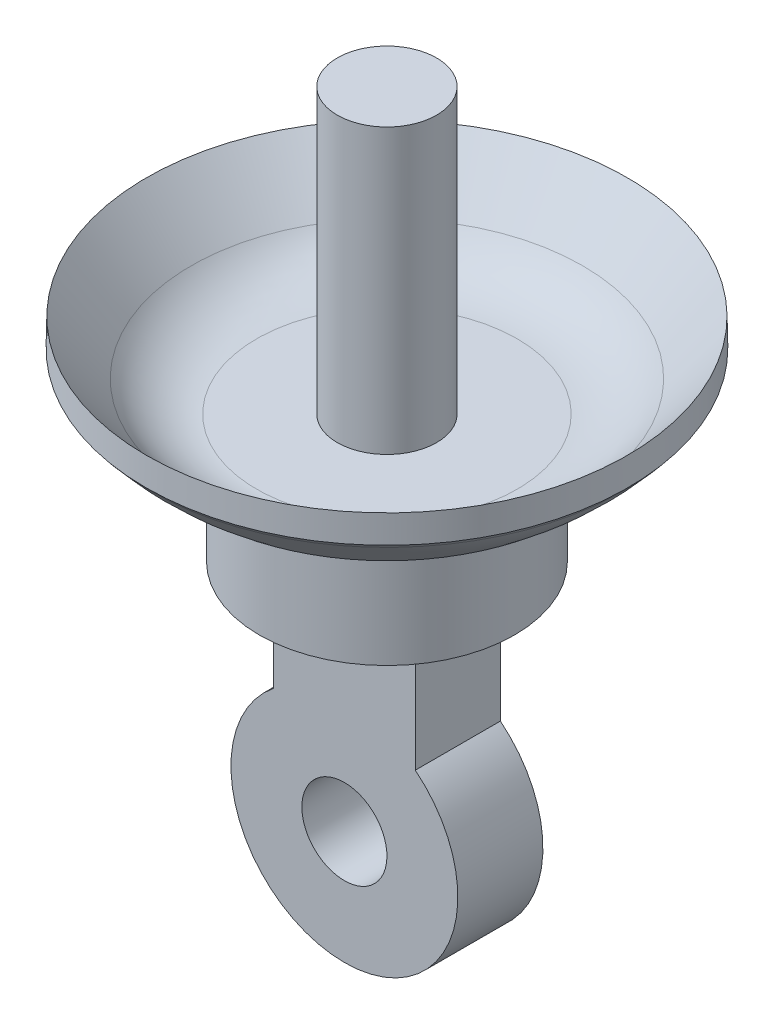
ISO-10303-21;
HEADER;
FILE_DESCRIPTION(('STEP AP214'),'2;1');
FILE_NAME('part.step','',(''),(''),'','','');
FILE_SCHEMA(('AUTOMOTIVE_DESIGN { 1 0 10303 214 1 1 1 1 }'));
ENDSEC;
DATA;
#1=APPLICATION_CONTEXT('core data for automotive mechanical design processes');
#2=APPLICATION_PROTOCOL_DEFINITION('international standard','automotive_design',2000,#1);
#3=PRODUCT_CONTEXT('',#1,'mechanical');
#4=PRODUCT('Part','Part','',(#3));
#5=PRODUCT_RELATED_PRODUCT_CATEGORY('part','',(#4));
#6=PRODUCT_DEFINITION_FORMATION('','',#4);
#7=PRODUCT_DEFINITION_CONTEXT('part definition',#1,'design');
#8=PRODUCT_DEFINITION('design','',#6,#7);
#9=PRODUCT_DEFINITION_SHAPE('','',#8);
#10=(LENGTH_UNIT() NAMED_UNIT(*) SI_UNIT(.MILLI.,.METRE.));
#11=(NAMED_UNIT(*) PLANE_ANGLE_UNIT() SI_UNIT($,.RADIAN.));
#12=(NAMED_UNIT(*) SI_UNIT($,.STERADIAN.) SOLID_ANGLE_UNIT());
#13=UNCERTAINTY_MEASURE_WITH_UNIT(LENGTH_MEASURE(1.E-05),#10,'distance_accuracy_value','');
#14=(GEOMETRIC_REPRESENTATION_CONTEXT(3) GLOBAL_UNCERTAINTY_ASSIGNED_CONTEXT((#13)) GLOBAL_UNIT_ASSIGNED_CONTEXT((#10,
#11,#12)) REPRESENTATION_CONTEXT('',''));
#15=CARTESIAN_POINT('',(0.,0.,0.));
#16=DIRECTION('',(0.,0.,1.));
#17=DIRECTION('',(1.,0.,0.));
#18=AXIS2_PLACEMENT_3D('',#15,#16,#17);
#19=CARTESIAN_POINT('',(0.,-38.5,0.));
#20=DIRECTION('',(0.,-1.,0.));
#21=DIRECTION('',(0.,0.,-1.));
#22=AXIS2_PLACEMENT_3D('',#19,#20,#21);
#23=PLANE('',#22);
#24=CARTESIAN_POINT('',(0.,-38.5,0.));
#25=DIRECTION('',(0.,-1.,0.));
#26=DIRECTION('',(0.,0.,-1.));
#27=AXIS2_PLACEMENT_3D('',#24,#25,#26);
#28=CIRCLE('',#27,4.5);
#29=CARTESIAN_POINT('',(0.,-38.5,-4.5));
#30=VERTEX_POINT('',#29);
#31=EDGE_CURVE('E91',#30,#30,#28,.T.);
#32=ORIENTED_EDGE('',*,*,#31,.T.);
#33=EDGE_LOOP('',(#32));
#34=FACE_BOUND('',#33,.T.);
#35=DIRECTION('',(-1.,0.,0.));
#36=VECTOR('',#35,1.);
#37=CARTESIAN_POINT('',(-2.5,-38.5,1.5));
#38=LINE('',#37,#36);
#39=CARTESIAN_POINT('',(2.5,-38.5,1.5));
#40=VERTEX_POINT('',#39);
#41=CARTESIAN_POINT('',(-2.5,-38.5,1.5));
#42=VERTEX_POINT('',#41);
#43=EDGE_CURVE('E87',#40,#42,#38,.T.);
#44=ORIENTED_EDGE('',*,*,#43,.F.);
#45=DIRECTION('',(0.,0.,1.));
#46=VECTOR('',#45,1.);
#47=CARTESIAN_POINT('',(2.5,-38.5,-1.5));
#48=LINE('',#47,#46);
#49=CARTESIAN_POINT('',(2.5,-38.5,-1.5));
#50=VERTEX_POINT('',#49);
#51=EDGE_CURVE('E95',#50,#40,#48,.T.);
#52=ORIENTED_EDGE('',*,*,#51,.F.);
#53=DIRECTION('',(1.,0.,0.));
#54=VECTOR('',#53,1.);
#55=CARTESIAN_POINT('',(-2.5,-38.5,-1.5));
#56=LINE('',#55,#54);
#57=CARTESIAN_POINT('',(-2.5,-38.5,-1.5));
#58=VERTEX_POINT('',#57);
#59=EDGE_CURVE('E107',#58,#50,#56,.T.);
#60=ORIENTED_EDGE('',*,*,#59,.F.);
#61=DIRECTION('',(0.,0.,-1.));
#62=VECTOR('',#61,1.);
#63=CARTESIAN_POINT('',(-2.5,-38.5,-1.5));
#64=LINE('',#63,#62);
#65=EDGE_CURVE('E105',#42,#58,#64,.T.);
#66=ORIENTED_EDGE('',*,*,#65,.F.);
#67=EDGE_LOOP('',(#44,#52,#60,#66));
#68=FACE_BOUND('',#67,.T.);
#69=ADVANCED_FACE('F43',(#34,#68),#23,.T.);
#70=CARTESIAN_POINT('',(0.,-34.,0.));
#71=DIRECTION('',(0.,1.,0.));
#72=DIRECTION('',(0.,0.,1.));
#73=AXIS2_PLACEMENT_3D('',#70,#71,#72);
#74=CYLINDRICAL_SURFACE('',#73,1.75);
#75=CARTESIAN_POINT('',(0.,-34.,0.));
#76=DIRECTION('',(0.,-1.,0.));
#77=DIRECTION('',(0.,0.,-1.));
#78=AXIS2_PLACEMENT_3D('',#75,#76,#77);
#79=CIRCLE('',#78,1.75);
#80=CARTESIAN_POINT('',(0.,-34.,-1.75));
#81=VERTEX_POINT('',#80);
#82=EDGE_CURVE('E124',#81,#81,#79,.T.);
#83=ORIENTED_EDGE('',*,*,#82,.F.);
#84=EDGE_LOOP('',(#83));
#85=FACE_BOUND('',#84,.T.);
#86=CARTESIAN_POINT('',(0.,-24.,0.));
#87=DIRECTION('',(0.,1.,0.));
#88=DIRECTION('',(0.,0.,1.));
#89=AXIS2_PLACEMENT_3D('',#86,#87,#88);
#90=CIRCLE('',#89,1.75);
#91=CARTESIAN_POINT('',(0.,-24.,1.75));
#92=VERTEX_POINT('',#91);
#93=EDGE_CURVE('E283',#92,#92,#90,.T.);
#94=ORIENTED_EDGE('',*,*,#93,.F.);
#95=EDGE_LOOP('',(#94));
#96=FACE_BOUND('',#95,.T.);
#97=ADVANCED_FACE('F153',(#85,#96),#74,.T.);
#98=CARTESIAN_POINT('',(0.,-34.,0.));
#99=DIRECTION('',(0.,-1.,0.));
#100=DIRECTION('',(0.,0.,-1.));
#101=AXIS2_PLACEMENT_3D('',#98,#99,#100);
#102=PLANE('',#101);
#103=CARTESIAN_POINT('',(0.,-34.,0.));
#104=DIRECTION('',(0.,-1.,0.));
#105=DIRECTION('',(0.,0.,-1.));
#106=AXIS2_PLACEMENT_3D('',#103,#104,#105);
#107=CIRCLE('',#106,4.59487516204667);
#108=CARTESIAN_POINT('',(0.,-34.,-4.59487516204667));
#109=VERTEX_POINT('',#108);
#110=EDGE_CURVE('E51',#109,#109,#107,.F.);
#111=ORIENTED_EDGE('',*,*,#110,.T.);
#112=EDGE_LOOP('',(#111));
#113=FACE_BOUND('',#112,.T.);
#114=ORIENTED_EDGE('',*,*,#82,.T.);
#115=EDGE_LOOP('',(#114));
#116=FACE_BOUND('',#115,.T.);
#117=ADVANCED_FACE('F135',(#113,#116),#102,.F.);
#118=CARTESIAN_POINT('',(0.,-31.0237599526687,0.));
#119=DIRECTION('',(0.,1.,0.));
#120=DIRECTION('',(0.,0.,1.));
#121=AXIS2_PLACEMENT_3D('',#118,#119,#120);
#122=CONICAL_SURFACE('',#121,8.48020003944276,0.694738276196702);
#123=CARTESIAN_POINT('',(0.,-32.9205531989934,0.));
#124=DIRECTION('',(0.,1.,0.));
#125=DIRECTION('',(0.,0.,1.));
#126=AXIS2_PLACEMENT_3D('',#123,#124,#125);
#127=CIRCLE('',#126,6.8995390008388);
#128=CARTESIAN_POINT('',(0.,-32.9205531989934,6.8995390008388));
#129=VERTEX_POINT('',#128);
#130=EDGE_CURVE('E13',#129,#129,#127,.F.);
#131=ORIENTED_EDGE('',*,*,#130,.T.);
#132=EDGE_LOOP('',(#131));
#133=FACE_BOUND('',#132,.T.);
#134=CARTESIAN_POINT('',(0.,-31.0237599526687,0.));
#135=DIRECTION('',(0.,1.,0.));
#136=DIRECTION('',(0.,0.,1.));
#137=AXIS2_PLACEMENT_3D('',#134,#135,#136);
#138=CIRCLE('',#137,8.48020003944276);
#139=CARTESIAN_POINT('',(0.,-31.0237599526687,8.48020003944276));
#140=VERTEX_POINT('',#139);
#141=EDGE_CURVE('E121',#140,#140,#138,.T.);
#142=ORIENTED_EDGE('',*,*,#141,.T.);
#143=EDGE_LOOP('',(#142));
#144=FACE_BOUND('',#143,.T.);
#145=ADVANCED_FACE('F175',(#133,#144),#122,.F.);
#146=CARTESIAN_POINT('',(0.,-32.,0.));
#147=DIRECTION('',(0.,-1.,0.));
#148=DIRECTION('',(0.,0.,-1.));
#149=AXIS2_PLACEMENT_3D('',#146,#147,#148);
#150=CONICAL_SURFACE('',#149,8.5,0.0202790761884922);
#151=ORIENTED_EDGE('',*,*,#141,.F.);
#152=EDGE_LOOP('',(#151));
#153=FACE_BOUND('',#152,.T.);
#154=CARTESIAN_POINT('',(0.,-32.,0.));
#155=DIRECTION('',(0.,1.,0.));
#156=DIRECTION('',(0.,0.,1.));
#157=AXIS2_PLACEMENT_3D('',#154,#155,#156);
#158=CIRCLE('',#157,8.5);
#159=CARTESIAN_POINT('',(0.,-32.,8.5));
#160=VERTEX_POINT('',#159);
#161=EDGE_CURVE('E118',#160,#160,#158,.T.);
#162=ORIENTED_EDGE('',*,*,#161,.T.);
#163=EDGE_LOOP('',(#162));
#164=FACE_BOUND('',#163,.T.);
#165=ADVANCED_FACE('F171',(#153,#164),#150,.T.);
#166=CARTESIAN_POINT('',(0.,-35.,0.));
#167=DIRECTION('',(0.,1.,0.));
#168=DIRECTION('',(0.,0.,1.));
#169=AXIS2_PLACEMENT_3D('',#166,#167,#168);
#170=CONICAL_SURFACE('',#169,6.,0.694738276196702);
#171=CARTESIAN_POINT('',(0.,-32.1575325087842,0.));
#172=DIRECTION('',(0.,-1.,0.));
#173=DIRECTION('',(0.,0.,-1.));
#174=AXIS2_PLACEMENT_3D('',#171,#172,#173);
#175=CIRCLE('',#174,8.36872290934652);
#176=CARTESIAN_POINT('',(0.,-32.1575325087842,-8.36872290934652));
#177=VERTEX_POINT('',#176);
#178=EDGE_CURVE('E130',#177,#177,#175,.F.);
#179=ORIENTED_EDGE('',*,*,#178,.T.);
#180=EDGE_LOOP('',(#179));
#181=FACE_BOUND('',#180,.T.);
#182=ORIENTED_EDGE('',*,*,#161,.F.);
#183=EDGE_LOOP('',(#182));
#184=FACE_BOUND('',#183,.T.);
#185=ADVANCED_FACE('F167',(#181,#184),#170,.T.);
#186=CARTESIAN_POINT('',(0.,-38.5,0.));
#187=DIRECTION('',(0.,1.,0.));
#188=DIRECTION('',(0.,0.,1.));
#189=AXIS2_PLACEMENT_3D('',#186,#187,#188);
#190=CYLINDRICAL_SURFACE('',#189,4.5);
#191=ORIENTED_EDGE('',*,*,#31,.F.);
#192=EDGE_LOOP('',(#191));
#193=FACE_BOUND('',#192,.T.);
#194=CARTESIAN_POINT('',(0.,-35.,0.));
#195=DIRECTION('',(0.,1.,0.));
#196=DIRECTION('',(0.,0.,1.));
#197=AXIS2_PLACEMENT_3D('',#194,#195,#196);
#198=CIRCLE('',#197,4.5);
#199=CARTESIAN_POINT('',(0.,-35.,4.5));
#200=VERTEX_POINT('',#199);
#201=EDGE_CURVE('E127',#200,#200,#198,.F.);
#202=ORIENTED_EDGE('',*,*,#201,.T.);
#203=EDGE_LOOP('',(#202));
#204=FACE_BOUND('',#203,.T.);
#205=ADVANCED_FACE('F164',(#193,#204),#190,.T.);
#206=CARTESIAN_POINT('',(2.5,-43.5,-1.5));
#207=DIRECTION('',(-1.,0.,0.));
#208=DIRECTION('',(0.,0.,1.));
#209=AXIS2_PLACEMENT_3D('',#206,#207,#208);
#210=PLANE('',#209);
#211=DIRECTION('',(0.,1.,0.));
#212=VECTOR('',#211,1.);
#213=CARTESIAN_POINT('',(2.5,-43.5,1.5));
#214=LINE('',#213,#212);
#215=CARTESIAN_POINT('',(2.5,-42.8771375983843,1.5));
#216=VERTEX_POINT('',#215);
#217=EDGE_CURVE('E58',#216,#40,#214,.T.);
#218=ORIENTED_EDGE('',*,*,#217,.F.);
#219=DIRECTION('',(0.,0.,1.));
#220=VECTOR('',#219,1.);
#221=CARTESIAN_POINT('',(2.5,-42.8771375983843,-1.5));
#222=LINE('',#221,#220);
#223=CARTESIAN_POINT('',(2.5,-42.8771375983843,-1.5));
#224=VERTEX_POINT('',#223);
#225=EDGE_CURVE('E102',#216,#224,#222,.F.);
#226=ORIENTED_EDGE('',*,*,#225,.T.);
#227=DIRECTION('',(0.,1.,0.));
#228=VECTOR('',#227,1.);
#229=CARTESIAN_POINT('',(2.5,-43.5,-1.5));
#230=LINE('',#229,#228);
#231=EDGE_CURVE('E98',#224,#50,#230,.T.);
#232=ORIENTED_EDGE('',*,*,#231,.T.);
#233=ORIENTED_EDGE('',*,*,#51,.T.);
#234=EDGE_LOOP('',(#218,#226,#232,#233));
#235=FACE_BOUND('',#234,.T.);
#236=ADVANCED_FACE('F96',(#235),#210,.F.);
#237=CARTESIAN_POINT('',(-2.5,-43.5,1.5));
#238=DIRECTION('',(0.,0.,-1.));
#239=DIRECTION('',(0.,1.,0.));
#240=AXIS2_PLACEMENT_3D('',#237,#238,#239);
#241=PLANE('',#240);
#242=CARTESIAN_POINT('',(0.00045395495483194,-45.9999999982827,1.5));
#243=DIRECTION('',(0.,0.,1.));
#244=DIRECTION('',(1.,0.,0.));
#245=AXIS2_PLACEMENT_3D('',#242,#243,#244);
#246=CIRCLE('',#245,4.);
#247=CARTESIAN_POINT('',(-2.5,-42.8778645080852,1.5));
#248=VERTEX_POINT('',#247);
#249=EDGE_CURVE('E90',#248,#216,#246,.T.);
#250=ORIENTED_EDGE('',*,*,#249,.T.);
#251=ORIENTED_EDGE('',*,*,#217,.T.);
#252=ORIENTED_EDGE('',*,*,#43,.T.);
#253=DIRECTION('',(0.,1.,0.));
#254=VECTOR('',#253,1.);
#255=CARTESIAN_POINT('',(-2.5,-43.5,1.5));
#256=LINE('',#255,#254);
#257=EDGE_CURVE('E92',#248,#42,#256,.T.);
#258=ORIENTED_EDGE('',*,*,#257,.F.);
#259=EDGE_LOOP('',(#250,#251,#252,#258));
#260=FACE_BOUND('',#259,.T.);
#261=CARTESIAN_POINT('',(0.00045395495483194,-45.9999999982827,1.5));
#262=DIRECTION('',(0.,0.,-1.));
#263=DIRECTION('',(0.,1.,0.));
#264=AXIS2_PLACEMENT_3D('',#261,#262,#263);
#265=CIRCLE('',#264,1.5);
#266=CARTESIAN_POINT('',(0.00045395495483194,-44.4999999982827,1.5));
#267=VERTEX_POINT('',#266);
#268=EDGE_CURVE('E277',#267,#267,#265,.F.);
#269=ORIENTED_EDGE('',*,*,#268,.F.);
#270=EDGE_LOOP('',(#269));
#271=FACE_BOUND('',#270,.T.);
#272=ADVANCED_FACE('F84',(#260,#271),#241,.F.);
#273=CARTESIAN_POINT('',(-2.5,-43.5,-1.5));
#274=DIRECTION('',(1.,0.,0.));
#275=DIRECTION('',(0.,0.,-1.));
#276=AXIS2_PLACEMENT_3D('',#273,#274,#275);
#277=PLANE('',#276);
#278=DIRECTION('',(0.,1.,0.));
#279=VECTOR('',#278,1.);
#280=CARTESIAN_POINT('',(-2.5,-43.5,-1.5));
#281=LINE('',#280,#279);
#282=CARTESIAN_POINT('',(-2.5,-42.8778645080852,-1.5));
#283=VERTEX_POINT('',#282);
#284=EDGE_CURVE('E113',#283,#58,#281,.T.);
#285=ORIENTED_EDGE('',*,*,#284,.F.);
#286=DIRECTION('',(0.,0.,1.));
#287=VECTOR('',#286,1.);
#288=CARTESIAN_POINT('',(-2.5,-42.8778645080852,-1.5));
#289=LINE('',#288,#287);
#290=EDGE_CURVE('E66',#283,#248,#289,.T.);
#291=ORIENTED_EDGE('',*,*,#290,.T.);
#292=ORIENTED_EDGE('',*,*,#257,.T.);
#293=ORIENTED_EDGE('',*,*,#65,.T.);
#294=EDGE_LOOP('',(#285,#291,#292,#293));
#295=FACE_BOUND('',#294,.T.);
#296=ADVANCED_FACE('F215',(#295),#277,.F.);
#297=CARTESIAN_POINT('',(-2.5,-43.5,-1.5));
#298=DIRECTION('',(0.,0.,1.));
#299=DIRECTION('',(0.,-1.,0.));
#300=AXIS2_PLACEMENT_3D('',#297,#298,#299);
#301=PLANE('',#300);
#302=ORIENTED_EDGE('',*,*,#231,.F.);
#303=CARTESIAN_POINT('',(0.00045395495483194,-45.9999999982827,-1.5));
#304=DIRECTION('',(0.,0.,1.));
#305=DIRECTION('',(1.,0.,0.));
#306=AXIS2_PLACEMENT_3D('',#303,#304,#305);
#307=CIRCLE('',#306,4.);
#308=EDGE_CURVE('E289',#283,#224,#307,.T.);
#309=ORIENTED_EDGE('',*,*,#308,.F.);
#310=ORIENTED_EDGE('',*,*,#284,.T.);
#311=ORIENTED_EDGE('',*,*,#59,.T.);
#312=EDGE_LOOP('',(#302,#309,#310,#311));
#313=FACE_BOUND('',#312,.T.);
#314=CARTESIAN_POINT('',(0.00045395495483194,-45.9999999982827,-1.5));
#315=DIRECTION('',(0.,0.,-1.));
#316=DIRECTION('',(0.,1.,0.));
#317=AXIS2_PLACEMENT_3D('',#314,#315,#316);
#318=CIRCLE('',#317,1.5);
#319=CARTESIAN_POINT('',(0.00045395495483194,-44.4999999982827,-1.5));
#320=VERTEX_POINT('',#319);
#321=EDGE_CURVE('E280',#320,#320,#318,.T.);
#322=ORIENTED_EDGE('',*,*,#321,.F.);
#323=EDGE_LOOP('',(#322));
#324=FACE_BOUND('',#323,.T.);
#325=ADVANCED_FACE('F222',(#313,#324),#301,.F.);
#326=CARTESIAN_POINT('',(0.00045395495483194,-45.9999999982827,-1.5));
#327=DIRECTION('',(0.,0.,1.));
#328=DIRECTION('',(1.,0.,0.));
#329=AXIS2_PLACEMENT_3D('',#326,#327,#328);
#330=CYLINDRICAL_SURFACE('',#329,4.);
#331=ORIENTED_EDGE('',*,*,#225,.F.);
#332=ORIENTED_EDGE('',*,*,#249,.F.);
#333=ORIENTED_EDGE('',*,*,#290,.F.);
#334=ORIENTED_EDGE('',*,*,#308,.T.);
#335=EDGE_LOOP('',(#331,#332,#333,#334));
#336=FACE_BOUND('',#335,.T.);
#337=ADVANCED_FACE('F149',(#336),#330,.T.);
#338=CARTESIAN_POINT('',(0.,-25.7556885121394,0.));
#339=DIRECTION('',(0.,-1.,0.));
#340=DIRECTION('',(0.,0.,-1.));
#341=AXIS2_PLACEMENT_3D('',#338,#339,#340);
#342=DEGENERATE_TOROIDAL_SURFACE('',#341,0.686510113372753,10.,.T.);
#343=ORIENTED_EDGE('',*,*,#201,.F.);
#344=EDGE_LOOP('',(#343));
#345=FACE_BOUND('',#344,.T.);
#346=ORIENTED_EDGE('',*,*,#178,.F.);
#347=EDGE_LOOP('',(#346));
#348=FACE_BOUND('',#347,.T.);
#349=ADVANCED_FACE('F140',(#345,#348),#342,.T.);
#350=CARTESIAN_POINT('',(0.,-31.,0.));
#351=DIRECTION('',(0.,-1.,0.));
#352=DIRECTION('',(0.,0.,-1.));
#353=AXIS2_PLACEMENT_3D('',#350,#351,#352);
#354=TOROIDAL_SURFACE('',#353,4.59487516204667,3.);
#355=ORIENTED_EDGE('',*,*,#130,.F.);
#356=EDGE_LOOP('',(#355));
#357=FACE_BOUND('',#356,.T.);
#358=ORIENTED_EDGE('',*,*,#110,.F.);
#359=EDGE_LOOP('',(#358));
#360=FACE_BOUND('',#359,.T.);
#361=ADVANCED_FACE('F45',(#357,#360),#354,.F.);
#362=CARTESIAN_POINT('',(0.,-24.,0.));
#363=DIRECTION('',(0.,1.,0.));
#364=DIRECTION('',(0.,0.,1.));
#365=AXIS2_PLACEMENT_3D('',#362,#363,#364);
#366=PLANE('',#365);
#367=ORIENTED_EDGE('',*,*,#93,.T.);
#368=EDGE_LOOP('',(#367));
#369=FACE_BOUND('',#368,.T.);
#370=ADVANCED_FACE('F139',(#369),#366,.T.);
#371=CARTESIAN_POINT('',(0.00045395495483194,-45.9999999982827,8.57106781186548));
#372=DIRECTION('',(0.,0.,-1.));
#373=DIRECTION('',(0.,1.,0.));
#374=AXIS2_PLACEMENT_3D('',#371,#372,#373);
#375=CYLINDRICAL_SURFACE('',#374,1.5);
#376=ORIENTED_EDGE('',*,*,#268,.T.);
#377=EDGE_LOOP('',(#376));
#378=FACE_BOUND('',#377,.T.);
#379=ORIENTED_EDGE('',*,*,#321,.T.);
#380=EDGE_LOOP('',(#379));
#381=FACE_BOUND('',#380,.T.);
#382=ADVANCED_FACE('F146',(#378,#381),#375,.F.);
#383=CLOSED_SHELL('',(#69,#97,#117,#145,#165,#185,#205,#236,#272,#296,#325,#337,#349,#361,#370,#382));
#384=MANIFOLD_SOLID_BREP('B2',#383);
#385=ADVANCED_BREP_SHAPE_REPRESENTATION('',(#18,#384),#14);
#386=SHAPE_DEFINITION_REPRESENTATION(#9,#385);
ENDSEC;
END-ISO-10303-21;
